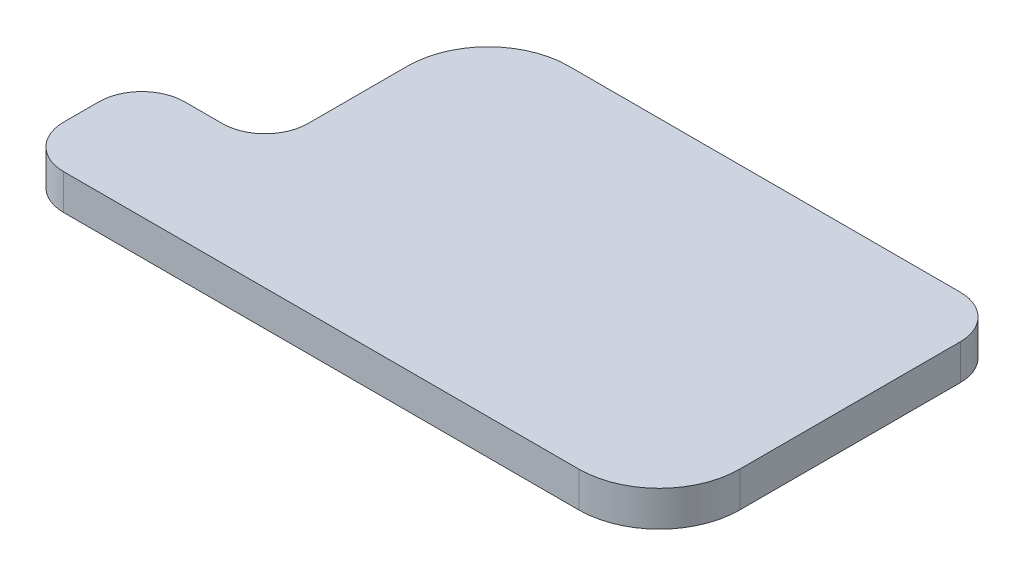
ISO-10303-21;
HEADER;
FILE_DESCRIPTION(('STEP AP214'),'2;1');
FILE_NAME('part.step','',(''),(''),'','','');
FILE_SCHEMA(('AUTOMOTIVE_DESIGN { 1 0 10303 214 1 1 1 1 }'));
ENDSEC;
DATA;
#1=APPLICATION_CONTEXT('core data for automotive mechanical design processes');
#2=APPLICATION_PROTOCOL_DEFINITION('international standard','automotive_design',2000,#1);
#3=PRODUCT_CONTEXT('',#1,'mechanical');
#4=PRODUCT('Part','Part','',(#3));
#5=PRODUCT_RELATED_PRODUCT_CATEGORY('part','',(#4));
#6=PRODUCT_DEFINITION_FORMATION('','',#4);
#7=PRODUCT_DEFINITION_CONTEXT('part definition',#1,'design');
#8=PRODUCT_DEFINITION('design','',#6,#7);
#9=PRODUCT_DEFINITION_SHAPE('','',#8);
#10=(LENGTH_UNIT() NAMED_UNIT(*) SI_UNIT(.MILLI.,.METRE.));
#11=(NAMED_UNIT(*) PLANE_ANGLE_UNIT() SI_UNIT($,.RADIAN.));
#12=(NAMED_UNIT(*) SI_UNIT($,.STERADIAN.) SOLID_ANGLE_UNIT());
#13=UNCERTAINTY_MEASURE_WITH_UNIT(LENGTH_MEASURE(1.E-05),#10,'distance_accuracy_value','');
#14=(GEOMETRIC_REPRESENTATION_CONTEXT(3) GLOBAL_UNCERTAINTY_ASSIGNED_CONTEXT((#13)) GLOBAL_UNIT_ASSIGNED_CONTEXT((#10,
#11,#12)) REPRESENTATION_CONTEXT('',''));
#15=CARTESIAN_POINT('',(0.,0.,0.));
#16=DIRECTION('',(0.,0.,1.));
#17=DIRECTION('',(1.,0.,0.));
#18=AXIS2_PLACEMENT_3D('',#15,#16,#17);
#19=CARTESIAN_POINT('',(0.,1.32,0.));
#20=DIRECTION('',(1.,0.,0.));
#21=DIRECTION('',(0.,0.,-1.));
#22=AXIS2_PLACEMENT_3D('',#19,#20,#21);
#23=PLANE('',#22);
#24=DIRECTION('',(0.,0.,1.));
#25=VECTOR('',#24,1.);
#26=CARTESIAN_POINT('',(0.,0.,0.));
#27=LINE('',#26,#25);
#28=CARTESIAN_POINT('',(0.,0.,-2.91));
#29=VERTEX_POINT('',#28);
#30=CARTESIAN_POINT('',(0.,0.,-1.6));
#31=VERTEX_POINT('',#30);
#32=EDGE_CURVE('E152',#29,#31,#27,.T.);
#33=ORIENTED_EDGE('',*,*,#32,.T.);
#34=DIRECTION('',(0.,-1.,0.));
#35=VECTOR('',#34,1.);
#36=CARTESIAN_POINT('',(0.,1.32,-1.6));
#37=LINE('',#36,#35);
#38=CARTESIAN_POINT('',(0.,1.32,-1.6));
#39=VERTEX_POINT('',#38);
#40=EDGE_CURVE('E185',#31,#39,#37,.F.);
#41=ORIENTED_EDGE('',*,*,#40,.T.);
#42=DIRECTION('',(0.,0.,1.));
#43=VECTOR('',#42,1.);
#44=CARTESIAN_POINT('',(0.,1.32,0.));
#45=LINE('',#44,#43);
#46=CARTESIAN_POINT('',(0.,1.32,-2.91));
#47=VERTEX_POINT('',#46);
#48=EDGE_CURVE('E159',#47,#39,#45,.T.);
#49=ORIENTED_EDGE('',*,*,#48,.F.);
#50=DIRECTION('',(0.,-1.,0.));
#51=VECTOR('',#50,1.);
#52=CARTESIAN_POINT('',(0.,1.32,-2.91));
#53=LINE('',#52,#51);
#54=EDGE_CURVE('E182',#47,#29,#53,.T.);
#55=ORIENTED_EDGE('',*,*,#54,.T.);
#56=EDGE_LOOP('',(#33,#41,#49,#55));
#57=FACE_BOUND('',#56,.T.);
#58=ADVANCED_FACE('F32',(#57),#23,.F.);
#59=CARTESIAN_POINT('',(0.,1.32,0.));
#60=DIRECTION('',(0.,0.,-1.));
#61=DIRECTION('',(-1.,0.,0.));
#62=AXIS2_PLACEMENT_3D('',#59,#60,#61);
#63=PLANE('',#62);
#64=DIRECTION('',(1.,0.,0.));
#65=VECTOR('',#64,1.);
#66=CARTESIAN_POINT('',(0.,1.32,0.));
#67=LINE('',#66,#65);
#68=CARTESIAN_POINT('',(1.6,1.32,0.));
#69=VERTEX_POINT('',#68);
#70=CARTESIAN_POINT('',(20.8,1.32,0.));
#71=VERTEX_POINT('',#70);
#72=EDGE_CURVE('E233',#69,#71,#67,.T.);
#73=ORIENTED_EDGE('',*,*,#72,.F.);
#74=DIRECTION('',(0.,-1.,0.));
#75=VECTOR('',#74,1.);
#76=CARTESIAN_POINT('',(1.6,1.32,0.));
#77=LINE('',#76,#75);
#78=CARTESIAN_POINT('',(1.6,0.,0.));
#79=VERTEX_POINT('',#78);
#80=EDGE_CURVE('E174',#69,#79,#77,.T.);
#81=ORIENTED_EDGE('',*,*,#80,.T.);
#82=DIRECTION('',(1.,0.,0.));
#83=VECTOR('',#82,1.);
#84=CARTESIAN_POINT('',(0.,0.,0.));
#85=LINE('',#84,#83);
#86=CARTESIAN_POINT('',(20.8,0.,0.));
#87=VERTEX_POINT('',#86);
#88=EDGE_CURVE('E148',#79,#87,#85,.T.);
#89=ORIENTED_EDGE('',*,*,#88,.T.);
#90=DIRECTION('',(0.,-1.,0.));
#91=VECTOR('',#90,1.);
#92=CARTESIAN_POINT('',(20.8,1.32,0.));
#93=LINE('',#92,#91);
#94=EDGE_CURVE('E128',#87,#71,#93,.F.);
#95=ORIENTED_EDGE('',*,*,#94,.T.);
#96=EDGE_LOOP('',(#73,#81,#89,#95));
#97=FACE_BOUND('',#96,.T.);
#98=ADVANCED_FACE('F235',(#97),#63,.F.);
#99=CARTESIAN_POINT('',(23.8,1.32,-12.82));
#100=DIRECTION('',(-1.,0.,0.));
#101=DIRECTION('',(0.,0.,1.));
#102=AXIS2_PLACEMENT_3D('',#99,#100,#101);
#103=PLANE('',#102);
#104=DIRECTION('',(0.,0.,-1.));
#105=VECTOR('',#104,1.);
#106=CARTESIAN_POINT('',(23.8,0.,-12.82));
#107=LINE('',#106,#105);
#108=CARTESIAN_POINT('',(23.8,0.,-3.));
#109=VERTEX_POINT('',#108);
#110=CARTESIAN_POINT('',(23.8,0.,-11.22));
#111=VERTEX_POINT('',#110);
#112=EDGE_CURVE('E138',#109,#111,#107,.T.);
#113=ORIENTED_EDGE('',*,*,#112,.T.);
#114=DIRECTION('',(0.,-1.,0.));
#115=VECTOR('',#114,1.);
#116=CARTESIAN_POINT('',(23.8,1.32,-11.22));
#117=LINE('',#116,#115);
#118=CARTESIAN_POINT('',(23.8,1.32,-11.22));
#119=VERTEX_POINT('',#118);
#120=EDGE_CURVE('E202',#111,#119,#117,.F.);
#121=ORIENTED_EDGE('',*,*,#120,.T.);
#122=DIRECTION('',(0.,0.,-1.));
#123=VECTOR('',#122,1.);
#124=CARTESIAN_POINT('',(23.8,1.32,-12.82));
#125=LINE('',#124,#123);
#126=CARTESIAN_POINT('',(23.8,1.32,-3.));
#127=VERTEX_POINT('',#126);
#128=EDGE_CURVE('E141',#127,#119,#125,.T.);
#129=ORIENTED_EDGE('',*,*,#128,.F.);
#130=DIRECTION('',(0.,-1.,0.));
#131=VECTOR('',#130,1.);
#132=CARTESIAN_POINT('',(23.8,1.32,-3.));
#133=LINE('',#132,#131);
#134=EDGE_CURVE('E126',#127,#109,#133,.T.);
#135=ORIENTED_EDGE('',*,*,#134,.T.);
#136=EDGE_LOOP('',(#113,#121,#129,#135));
#137=FACE_BOUND('',#136,.T.);
#138=ADVANCED_FACE('F137',(#137),#103,.F.);
#139=CARTESIAN_POINT('',(4.60000000000001,1.32,-12.82));
#140=DIRECTION('',(0.,0.,1.));
#141=DIRECTION('',(1.,0.,0.));
#142=AXIS2_PLACEMENT_3D('',#139,#140,#141);
#143=PLANE('',#142);
#144=DIRECTION('',(-1.,0.,0.));
#145=VECTOR('',#144,1.);
#146=CARTESIAN_POINT('',(4.60000000000001,1.32,-12.82));
#147=LINE('',#146,#145);
#148=CARTESIAN_POINT('',(22.2,1.32,-12.82));
#149=VERTEX_POINT('',#148);
#150=CARTESIAN_POINT('',(7.60000000000001,1.32,-12.82));
#151=VERTEX_POINT('',#150);
#152=EDGE_CURVE('E217',#149,#151,#147,.T.);
#153=ORIENTED_EDGE('',*,*,#152,.F.);
#154=DIRECTION('',(0.,-1.,0.));
#155=VECTOR('',#154,1.);
#156=CARTESIAN_POINT('',(22.2,1.32,-12.82));
#157=LINE('',#156,#155);
#158=CARTESIAN_POINT('',(22.2,0.,-12.82));
#159=VERTEX_POINT('',#158);
#160=EDGE_CURVE('E199',#149,#159,#157,.T.);
#161=ORIENTED_EDGE('',*,*,#160,.T.);
#162=DIRECTION('',(-1.,0.,0.));
#163=VECTOR('',#162,1.);
#164=CARTESIAN_POINT('',(4.60000000000001,0.,-12.82));
#165=LINE('',#164,#163);
#166=CARTESIAN_POINT('',(7.60000000000001,0.,-12.82));
#167=VERTEX_POINT('',#166);
#168=EDGE_CURVE('E147',#159,#167,#165,.T.);
#169=ORIENTED_EDGE('',*,*,#168,.T.);
#170=DIRECTION('',(0.,-1.,0.));
#171=VECTOR('',#170,1.);
#172=CARTESIAN_POINT('',(7.60000000000001,1.32,-12.82));
#173=LINE('',#172,#171);
#174=EDGE_CURVE('E171',#167,#151,#173,.F.);
#175=ORIENTED_EDGE('',*,*,#174,.T.);
#176=EDGE_LOOP('',(#153,#161,#169,#175));
#177=FACE_BOUND('',#176,.T.);
#178=ADVANCED_FACE('F245',(#177),#143,.F.);
#179=CARTESIAN_POINT('',(4.60000000000001,1.32,-4.51));
#180=DIRECTION('',(1.,0.,0.));
#181=DIRECTION('',(0.,0.,-1.));
#182=AXIS2_PLACEMENT_3D('',#179,#180,#181);
#183=PLANE('',#182);
#184=DIRECTION('',(0.,0.,1.));
#185=VECTOR('',#184,1.);
#186=CARTESIAN_POINT('',(4.60000000000001,0.,-4.51));
#187=LINE('',#186,#185);
#188=CARTESIAN_POINT('',(4.60000000000001,0.,-9.82));
#189=VERTEX_POINT('',#188);
#190=CARTESIAN_POINT('',(4.60000000000001,0.,-6.11));
#191=VERTEX_POINT('',#190);
#192=EDGE_CURVE('E150',#189,#191,#187,.T.);
#193=ORIENTED_EDGE('',*,*,#192,.T.);
#194=DIRECTION('',(0.,-1.,0.));
#195=VECTOR('',#194,1.);
#196=CARTESIAN_POINT('',(4.60000000000001,1.32,-6.11));
#197=LINE('',#196,#195);
#198=CARTESIAN_POINT('',(4.60000000000001,1.32,-6.11));
#199=VERTEX_POINT('',#198);
#200=EDGE_CURVE('E197',#191,#199,#197,.F.);
#201=ORIENTED_EDGE('',*,*,#200,.T.);
#202=DIRECTION('',(0.,0.,1.));
#203=VECTOR('',#202,1.);
#204=CARTESIAN_POINT('',(4.60000000000001,1.32,-4.51));
#205=LINE('',#204,#203);
#206=CARTESIAN_POINT('',(4.60000000000001,1.32,-9.82));
#207=VERTEX_POINT('',#206);
#208=EDGE_CURVE('E215',#207,#199,#205,.T.);
#209=ORIENTED_EDGE('',*,*,#208,.F.);
#210=DIRECTION('',(0.,-1.,0.));
#211=VECTOR('',#210,1.);
#212=CARTESIAN_POINT('',(4.60000000000001,1.32,-9.82));
#213=LINE('',#212,#211);
#214=EDGE_CURVE('E168',#207,#189,#213,.T.);
#215=ORIENTED_EDGE('',*,*,#214,.T.);
#216=EDGE_LOOP('',(#193,#201,#209,#215));
#217=FACE_BOUND('',#216,.T.);
#218=ADVANCED_FACE('F209',(#217),#183,.F.);
#219=CARTESIAN_POINT('',(0.,1.32,-4.51));
#220=DIRECTION('',(0.,0.,1.));
#221=DIRECTION('',(1.,0.,0.));
#222=AXIS2_PLACEMENT_3D('',#219,#220,#221);
#223=PLANE('',#222);
#224=DIRECTION('',(-1.,0.,0.));
#225=VECTOR('',#224,1.);
#226=CARTESIAN_POINT('',(0.,0.,-4.51));
#227=LINE('',#226,#225);
#228=CARTESIAN_POINT('',(3.00000000000001,0.,-4.51));
#229=VERTEX_POINT('',#228);
#230=CARTESIAN_POINT('',(1.6,0.,-4.51));
#231=VERTEX_POINT('',#230);
#232=EDGE_CURVE('E158',#229,#231,#227,.T.);
#233=ORIENTED_EDGE('',*,*,#232,.T.);
#234=DIRECTION('',(0.,-1.,0.));
#235=VECTOR('',#234,1.);
#236=CARTESIAN_POINT('',(1.6,1.32,-4.51));
#237=LINE('',#236,#235);
#238=CARTESIAN_POINT('',(1.6,1.32,-4.51));
#239=VERTEX_POINT('',#238);
#240=EDGE_CURVE('E47',#231,#239,#237,.F.);
#241=ORIENTED_EDGE('',*,*,#240,.T.);
#242=DIRECTION('',(-1.,0.,0.));
#243=VECTOR('',#242,1.);
#244=CARTESIAN_POINT('',(0.,1.32,-4.51));
#245=LINE('',#244,#243);
#246=CARTESIAN_POINT('',(3.00000000000001,1.32,-4.51));
#247=VERTEX_POINT('',#246);
#248=EDGE_CURVE('E142',#247,#239,#245,.T.);
#249=ORIENTED_EDGE('',*,*,#248,.F.);
#250=DIRECTION('',(0.,-1.,0.));
#251=VECTOR('',#250,1.);
#252=CARTESIAN_POINT('',(3.00000000000001,0.,-4.51));
#253=LINE('',#252,#251);
#254=EDGE_CURVE('E193',#247,#229,#253,.T.);
#255=ORIENTED_EDGE('',*,*,#254,.T.);
#256=EDGE_LOOP('',(#233,#241,#249,#255));
#257=FACE_BOUND('',#256,.T.);
#258=ADVANCED_FACE('F213',(#257),#223,.F.);
#259=CARTESIAN_POINT('',(0.,1.32,0.));
#260=DIRECTION('',(0.,-1.,0.));
#261=DIRECTION('',(0.,0.,-1.));
#262=AXIS2_PLACEMENT_3D('',#259,#260,#261);
#263=PLANE('',#262);
#264=ORIENTED_EDGE('',*,*,#48,.T.);
#265=CARTESIAN_POINT('',(1.6,1.32,-1.6));
#266=DIRECTION('',(0.,-1.,0.));
#267=DIRECTION('',(0.,0.,-1.));
#268=AXIS2_PLACEMENT_3D('',#265,#266,#267);
#269=CIRCLE('',#268,1.6);
#270=EDGE_CURVE('E191',#39,#69,#269,.F.);
#271=ORIENTED_EDGE('',*,*,#270,.T.);
#272=ORIENTED_EDGE('',*,*,#72,.T.);
#273=CARTESIAN_POINT('',(20.8,1.32,-3.));
#274=DIRECTION('',(0.,-1.,0.));
#275=DIRECTION('',(0.,0.,-1.));
#276=AXIS2_PLACEMENT_3D('',#273,#274,#275);
#277=CIRCLE('',#276,3.);
#278=EDGE_CURVE('E166',#71,#127,#277,.F.);
#279=ORIENTED_EDGE('',*,*,#278,.T.);
#280=ORIENTED_EDGE('',*,*,#128,.T.);
#281=CARTESIAN_POINT('',(22.2,1.32,-11.22));
#282=DIRECTION('',(0.,-1.,0.));
#283=DIRECTION('',(0.,0.,-1.));
#284=AXIS2_PLACEMENT_3D('',#281,#282,#283);
#285=CIRCLE('',#284,1.6);
#286=EDGE_CURVE('E187',#119,#149,#285,.F.);
#287=ORIENTED_EDGE('',*,*,#286,.T.);
#288=ORIENTED_EDGE('',*,*,#152,.T.);
#289=CARTESIAN_POINT('',(7.60000000000001,1.32,-9.82));
#290=DIRECTION('',(0.,-1.,0.));
#291=DIRECTION('',(0.,0.,-1.));
#292=AXIS2_PLACEMENT_3D('',#289,#290,#291);
#293=CIRCLE('',#292,3.);
#294=EDGE_CURVE('E164',#151,#207,#293,.F.);
#295=ORIENTED_EDGE('',*,*,#294,.T.);
#296=ORIENTED_EDGE('',*,*,#208,.T.);
#297=CARTESIAN_POINT('',(3.00000000000001,1.32,-6.11));
#298=DIRECTION('',(0.,-1.,0.));
#299=DIRECTION('',(0.,0.,-1.));
#300=AXIS2_PLACEMENT_3D('',#297,#298,#299);
#301=CIRCLE('',#300,1.6);
#302=EDGE_CURVE('E11',#199,#247,#301,.T.);
#303=ORIENTED_EDGE('',*,*,#302,.T.);
#304=ORIENTED_EDGE('',*,*,#248,.T.);
#305=CARTESIAN_POINT('',(1.6,1.32,-2.91));
#306=DIRECTION('',(0.,-1.,0.));
#307=DIRECTION('',(0.,0.,-1.));
#308=AXIS2_PLACEMENT_3D('',#305,#306,#307);
#309=CIRCLE('',#308,1.6);
#310=EDGE_CURVE('E189',#239,#47,#309,.F.);
#311=ORIENTED_EDGE('',*,*,#310,.T.);
#312=EDGE_LOOP('',(#264,#271,#272,#279,#280,#287,#288,#295,#296,#303,#304,#311));
#313=FACE_BOUND('',#312,.T.);
#314=ADVANCED_FACE('F232',(#313),#263,.F.);
#315=CARTESIAN_POINT('',(0.,0.,0.));
#316=DIRECTION('',(0.,-1.,0.));
#317=DIRECTION('',(0.,0.,-1.));
#318=AXIS2_PLACEMENT_3D('',#315,#316,#317);
#319=PLANE('',#318);
#320=ORIENTED_EDGE('',*,*,#88,.F.);
#321=CARTESIAN_POINT('',(1.6,0.,-1.6));
#322=DIRECTION('',(0.,-1.,0.));
#323=DIRECTION('',(0.,0.,-1.));
#324=AXIS2_PLACEMENT_3D('',#321,#322,#323);
#325=CIRCLE('',#324,1.6);
#326=EDGE_CURVE('E180',#79,#31,#325,.T.);
#327=ORIENTED_EDGE('',*,*,#326,.T.);
#328=ORIENTED_EDGE('',*,*,#32,.F.);
#329=CARTESIAN_POINT('',(1.6,0.,-2.91));
#330=DIRECTION('',(0.,-1.,0.));
#331=DIRECTION('',(0.,0.,-1.));
#332=AXIS2_PLACEMENT_3D('',#329,#330,#331);
#333=CIRCLE('',#332,1.6);
#334=EDGE_CURVE('E178',#29,#231,#333,.T.);
#335=ORIENTED_EDGE('',*,*,#334,.T.);
#336=ORIENTED_EDGE('',*,*,#232,.F.);
#337=CARTESIAN_POINT('',(3.00000000000001,0.,-6.11));
#338=DIRECTION('',(0.,-1.,0.));
#339=DIRECTION('',(0.,0.,-1.));
#340=AXIS2_PLACEMENT_3D('',#337,#338,#339);
#341=CIRCLE('',#340,1.6);
#342=EDGE_CURVE('E40',#229,#191,#341,.F.);
#343=ORIENTED_EDGE('',*,*,#342,.T.);
#344=ORIENTED_EDGE('',*,*,#192,.F.);
#345=CARTESIAN_POINT('',(7.60000000000001,0.,-9.82));
#346=DIRECTION('',(0.,-1.,0.));
#347=DIRECTION('',(0.,0.,-1.));
#348=AXIS2_PLACEMENT_3D('',#345,#346,#347);
#349=CIRCLE('',#348,3.);
#350=EDGE_CURVE('E132',#189,#167,#349,.T.);
#351=ORIENTED_EDGE('',*,*,#350,.T.);
#352=ORIENTED_EDGE('',*,*,#168,.F.);
#353=CARTESIAN_POINT('',(22.2,0.,-11.22));
#354=DIRECTION('',(0.,-1.,0.));
#355=DIRECTION('',(0.,0.,-1.));
#356=AXIS2_PLACEMENT_3D('',#353,#354,#355);
#357=CIRCLE('',#356,1.6);
#358=EDGE_CURVE('E146',#159,#111,#357,.T.);
#359=ORIENTED_EDGE('',*,*,#358,.T.);
#360=ORIENTED_EDGE('',*,*,#112,.F.);
#361=CARTESIAN_POINT('',(20.8,0.,-3.));
#362=DIRECTION('',(0.,-1.,0.));
#363=DIRECTION('',(0.,0.,-1.));
#364=AXIS2_PLACEMENT_3D('',#361,#362,#363);
#365=CIRCLE('',#364,3.);
#366=EDGE_CURVE('E122',#109,#87,#365,.T.);
#367=ORIENTED_EDGE('',*,*,#366,.T.);
#368=EDGE_LOOP('',(#320,#327,#328,#335,#336,#343,#344,#351,#352,#359,#360,#367));
#369=FACE_BOUND('',#368,.T.);
#370=ADVANCED_FACE('F144',(#369),#319,.T.);
#371=CARTESIAN_POINT('',(20.8,1.32,-3.));
#372=DIRECTION('',(0.,-1.,0.));
#373=DIRECTION('',(0.,0.,-1.));
#374=AXIS2_PLACEMENT_3D('',#371,#372,#373);
#375=CYLINDRICAL_SURFACE('',#374,3.);
#376=ORIENTED_EDGE('',*,*,#278,.F.);
#377=ORIENTED_EDGE('',*,*,#94,.F.);
#378=ORIENTED_EDGE('',*,*,#366,.F.);
#379=ORIENTED_EDGE('',*,*,#134,.F.);
#380=EDGE_LOOP('',(#376,#377,#378,#379));
#381=FACE_BOUND('',#380,.T.);
#382=ADVANCED_FACE('F125',(#381),#375,.T.);
#383=CARTESIAN_POINT('',(7.60000000000001,1.32,-9.82));
#384=DIRECTION('',(0.,-1.,0.));
#385=DIRECTION('',(0.,0.,-1.));
#386=AXIS2_PLACEMENT_3D('',#383,#384,#385);
#387=CYLINDRICAL_SURFACE('',#386,3.);
#388=ORIENTED_EDGE('',*,*,#294,.F.);
#389=ORIENTED_EDGE('',*,*,#174,.F.);
#390=ORIENTED_EDGE('',*,*,#350,.F.);
#391=ORIENTED_EDGE('',*,*,#214,.F.);
#392=EDGE_LOOP('',(#388,#389,#390,#391));
#393=FACE_BOUND('',#392,.T.);
#394=ADVANCED_FACE('F247',(#393),#387,.T.);
#395=CARTESIAN_POINT('',(1.6,1.32,-1.6));
#396=DIRECTION('',(0.,-1.,0.));
#397=DIRECTION('',(0.,0.,-1.));
#398=AXIS2_PLACEMENT_3D('',#395,#396,#397);
#399=CYLINDRICAL_SURFACE('',#398,1.6);
#400=ORIENTED_EDGE('',*,*,#270,.F.);
#401=ORIENTED_EDGE('',*,*,#40,.F.);
#402=ORIENTED_EDGE('',*,*,#326,.F.);
#403=ORIENTED_EDGE('',*,*,#80,.F.);
#404=EDGE_LOOP('',(#400,#401,#402,#403));
#405=FACE_BOUND('',#404,.T.);
#406=ADVANCED_FACE('F229',(#405),#399,.T.);
#407=CARTESIAN_POINT('',(1.6,1.32,-2.91));
#408=DIRECTION('',(0.,-1.,0.));
#409=DIRECTION('',(0.,0.,-1.));
#410=AXIS2_PLACEMENT_3D('',#407,#408,#409);
#411=CYLINDRICAL_SURFACE('',#410,1.6);
#412=ORIENTED_EDGE('',*,*,#310,.F.);
#413=ORIENTED_EDGE('',*,*,#240,.F.);
#414=ORIENTED_EDGE('',*,*,#334,.F.);
#415=ORIENTED_EDGE('',*,*,#54,.F.);
#416=EDGE_LOOP('',(#412,#413,#414,#415));
#417=FACE_BOUND('',#416,.T.);
#418=ADVANCED_FACE('F254',(#417),#411,.T.);
#419=CARTESIAN_POINT('',(3.00000000000001,1.32,-6.11));
#420=DIRECTION('',(0.,1.,0.));
#421=DIRECTION('',(0.,0.,1.));
#422=AXIS2_PLACEMENT_3D('',#419,#420,#421);
#423=CYLINDRICAL_SURFACE('',#422,1.6);
#424=ORIENTED_EDGE('',*,*,#302,.F.);
#425=ORIENTED_EDGE('',*,*,#200,.F.);
#426=ORIENTED_EDGE('',*,*,#342,.F.);
#427=ORIENTED_EDGE('',*,*,#254,.F.);
#428=EDGE_LOOP('',(#424,#425,#426,#427));
#429=FACE_BOUND('',#428,.T.);
#430=ADVANCED_FACE('F212',(#429),#423,.F.);
#431=CARTESIAN_POINT('',(22.2,1.32,-11.22));
#432=DIRECTION('',(0.,-1.,0.));
#433=DIRECTION('',(0.,0.,-1.));
#434=AXIS2_PLACEMENT_3D('',#431,#432,#433);
#435=CYLINDRICAL_SURFACE('',#434,1.6);
#436=ORIENTED_EDGE('',*,*,#286,.F.);
#437=ORIENTED_EDGE('',*,*,#120,.F.);
#438=ORIENTED_EDGE('',*,*,#358,.F.);
#439=ORIENTED_EDGE('',*,*,#160,.F.);
#440=EDGE_LOOP('',(#436,#437,#438,#439));
#441=FACE_BOUND('',#440,.T.);
#442=ADVANCED_FACE('F34',(#441),#435,.T.);
#443=CLOSED_SHELL('',(#58,#98,#138,#178,#218,#258,#314,#370,#382,#394,#406,#418,#430,#442));
#444=MANIFOLD_SOLID_BREP('B2',#443);
#445=ADVANCED_BREP_SHAPE_REPRESENTATION('',(#18,#444),#14);
#446=SHAPE_DEFINITION_REPRESENTATION(#9,#445);
ENDSEC;
END-ISO-10303-21;
